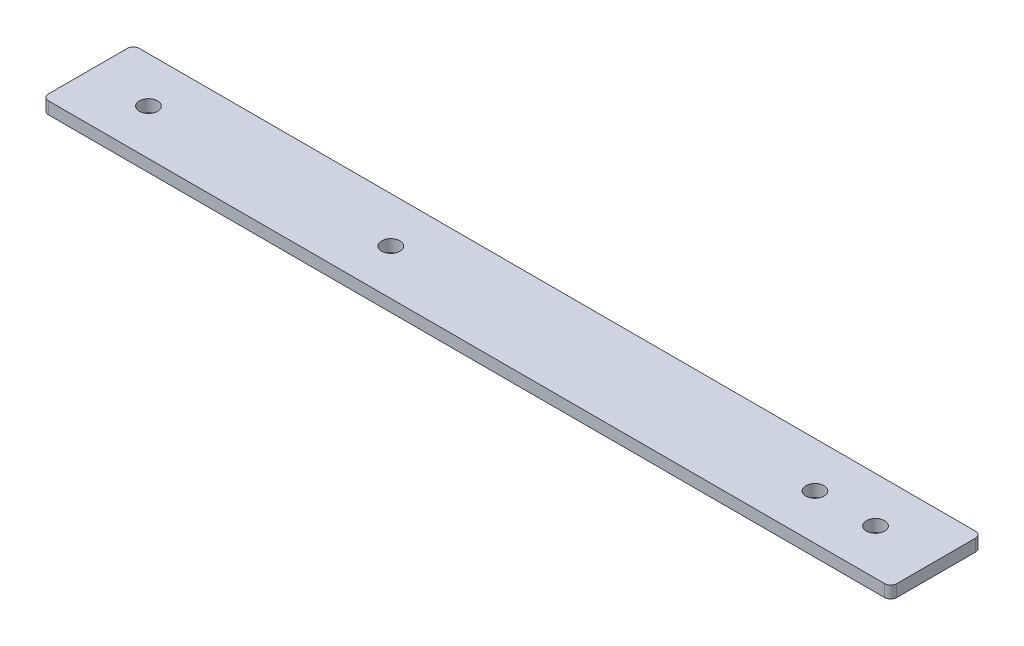
ISO-10303-21;
HEADER;
FILE_DESCRIPTION(('STEP AP214'),'2;1');
FILE_NAME('part.step','',(''),(''),'','','');
FILE_SCHEMA(('AUTOMOTIVE_DESIGN { 1 0 10303 214 1 1 1 1 }'));
ENDSEC;
DATA;
#1=APPLICATION_CONTEXT('core data for automotive mechanical design processes');
#2=APPLICATION_PROTOCOL_DEFINITION('international standard','automotive_design',2000,#1);
#3=PRODUCT_CONTEXT('',#1,'mechanical');
#4=PRODUCT('Part','Part','',(#3));
#5=PRODUCT_RELATED_PRODUCT_CATEGORY('part','',(#4));
#6=PRODUCT_DEFINITION_FORMATION('','',#4);
#7=PRODUCT_DEFINITION_CONTEXT('part definition',#1,'design');
#8=PRODUCT_DEFINITION('design','',#6,#7);
#9=PRODUCT_DEFINITION_SHAPE('','',#8);
#10=(LENGTH_UNIT() NAMED_UNIT(*) SI_UNIT(.MILLI.,.METRE.));
#11=(NAMED_UNIT(*) PLANE_ANGLE_UNIT() SI_UNIT($,.RADIAN.));
#12=(NAMED_UNIT(*) SI_UNIT($,.STERADIAN.) SOLID_ANGLE_UNIT());
#13=UNCERTAINTY_MEASURE_WITH_UNIT(LENGTH_MEASURE(1.E-05),#10,'distance_accuracy_value','');
#14=(GEOMETRIC_REPRESENTATION_CONTEXT(3) GLOBAL_UNCERTAINTY_ASSIGNED_CONTEXT((#13)) GLOBAL_UNIT_ASSIGNED_CONTEXT((#10,
#11,#12)) REPRESENTATION_CONTEXT('',''));
#15=CARTESIAN_POINT('',(0.,0.,0.));
#16=DIRECTION('',(0.,0.,1.));
#17=DIRECTION('',(1.,0.,0.));
#18=AXIS2_PLACEMENT_3D('',#15,#16,#17);
#19=CARTESIAN_POINT('',(0.,2.,0.));
#20=DIRECTION('',(0.,0.,-1.));
#21=DIRECTION('',(-1.,0.,0.));
#22=AXIS2_PLACEMENT_3D('',#19,#20,#21);
#23=PLANE('',#22);
#24=DIRECTION('',(1.,0.,0.));
#25=VECTOR('',#24,1.);
#26=CARTESIAN_POINT('',(0.,0.,0.));
#27=LINE('',#26,#25);
#28=CARTESIAN_POINT('',(1.,0.,0.));
#29=VERTEX_POINT('',#28);
#30=CARTESIAN_POINT('',(139.,0.,0.));
#31=VERTEX_POINT('',#30);
#32=EDGE_CURVE('E130',#29,#31,#27,.T.);
#33=ORIENTED_EDGE('',*,*,#32,.T.);
#34=DIRECTION('',(0.,-1.,0.));
#35=VECTOR('',#34,1.);
#36=CARTESIAN_POINT('',(139.,2.,0.));
#37=LINE('',#36,#35);
#38=CARTESIAN_POINT('',(139.,2.,0.));
#39=VERTEX_POINT('',#38);
#40=EDGE_CURVE('E107',#31,#39,#37,.F.);
#41=ORIENTED_EDGE('',*,*,#40,.T.);
#42=DIRECTION('',(1.,0.,0.));
#43=VECTOR('',#42,1.);
#44=CARTESIAN_POINT('',(0.,2.,0.));
#45=LINE('',#44,#43);
#46=CARTESIAN_POINT('',(1.,2.,0.));
#47=VERTEX_POINT('',#46);
#48=EDGE_CURVE('E145',#47,#39,#45,.T.);
#49=ORIENTED_EDGE('',*,*,#48,.F.);
#50=DIRECTION('',(0.,-1.,0.));
#51=VECTOR('',#50,1.);
#52=CARTESIAN_POINT('',(1.,0.,0.));
#53=LINE('',#52,#51);
#54=EDGE_CURVE('E112',#47,#29,#53,.T.);
#55=ORIENTED_EDGE('',*,*,#54,.T.);
#56=EDGE_LOOP('',(#33,#41,#49,#55));
#57=FACE_BOUND('',#56,.T.);
#58=ADVANCED_FACE('F35',(#57),#23,.F.);
#59=CARTESIAN_POINT('',(140.,2.,0.));
#60=DIRECTION('',(-1.,0.,0.));
#61=DIRECTION('',(0.,0.,1.));
#62=AXIS2_PLACEMENT_3D('',#59,#60,#61);
#63=PLANE('',#62);
#64=DIRECTION('',(0.,0.,-1.));
#65=VECTOR('',#64,1.);
#66=CARTESIAN_POINT('',(140.,2.,0.));
#67=LINE('',#66,#65);
#68=CARTESIAN_POINT('',(140.,2.,-1.));
#69=VERTEX_POINT('',#68);
#70=CARTESIAN_POINT('',(140.,2.,-14.));
#71=VERTEX_POINT('',#70);
#72=EDGE_CURVE('E122',#69,#71,#67,.T.);
#73=ORIENTED_EDGE('',*,*,#72,.F.);
#74=DIRECTION('',(0.,-1.,0.));
#75=VECTOR('',#74,1.);
#76=CARTESIAN_POINT('',(140.,2.,-1.));
#77=LINE('',#76,#75);
#78=CARTESIAN_POINT('',(140.,0.,-1.));
#79=VERTEX_POINT('',#78);
#80=EDGE_CURVE('E106',#69,#79,#77,.T.);
#81=ORIENTED_EDGE('',*,*,#80,.T.);
#82=DIRECTION('',(0.,0.,-1.));
#83=VECTOR('',#82,1.);
#84=CARTESIAN_POINT('',(140.,0.,0.));
#85=LINE('',#84,#83);
#86=CARTESIAN_POINT('',(140.,0.,-14.));
#87=VERTEX_POINT('',#86);
#88=EDGE_CURVE('E119',#79,#87,#85,.T.);
#89=ORIENTED_EDGE('',*,*,#88,.T.);
#90=DIRECTION('',(0.,-1.,0.));
#91=VECTOR('',#90,1.);
#92=CARTESIAN_POINT('',(140.,2.,-14.));
#93=LINE('',#92,#91);
#94=EDGE_CURVE('E124',#87,#71,#93,.F.);
#95=ORIENTED_EDGE('',*,*,#94,.T.);
#96=EDGE_LOOP('',(#73,#81,#89,#95));
#97=FACE_BOUND('',#96,.T.);
#98=ADVANCED_FACE('F118',(#97),#63,.F.);
#99=CARTESIAN_POINT('',(0.,2.,-15.));
#100=DIRECTION('',(0.,0.,-1.));
#101=DIRECTION('',(-1.,0.,0.));
#102=AXIS2_PLACEMENT_3D('',#99,#100,#101);
#103=PLANE('',#102);
#104=DIRECTION('',(1.,0.,0.));
#105=VECTOR('',#104,1.);
#106=CARTESIAN_POINT('',(0.,2.,-15.));
#107=LINE('',#106,#105);
#108=CARTESIAN_POINT('',(1.,2.,-15.));
#109=VERTEX_POINT('',#108);
#110=CARTESIAN_POINT('',(139.,2.,-15.));
#111=VERTEX_POINT('',#110);
#112=EDGE_CURVE('E185',#109,#111,#107,.T.);
#113=ORIENTED_EDGE('',*,*,#112,.T.);
#114=DIRECTION('',(0.,-1.,0.));
#115=VECTOR('',#114,1.);
#116=CARTESIAN_POINT('',(139.,0.,-15.));
#117=LINE('',#116,#115);
#118=CARTESIAN_POINT('',(139.,0.,-15.));
#119=VERTEX_POINT('',#118);
#120=EDGE_CURVE('E164',#111,#119,#117,.T.);
#121=ORIENTED_EDGE('',*,*,#120,.T.);
#122=DIRECTION('',(1.,0.,0.));
#123=VECTOR('',#122,1.);
#124=CARTESIAN_POINT('',(0.,0.,-15.));
#125=LINE('',#124,#123);
#126=CARTESIAN_POINT('',(1.,0.,-15.));
#127=VERTEX_POINT('',#126);
#128=EDGE_CURVE('E129',#127,#119,#125,.T.);
#129=ORIENTED_EDGE('',*,*,#128,.F.);
#130=DIRECTION('',(0.,-1.,0.));
#131=VECTOR('',#130,1.);
#132=CARTESIAN_POINT('',(1.,2.,-15.));
#133=LINE('',#132,#131);
#134=EDGE_CURVE('E162',#127,#109,#133,.F.);
#135=ORIENTED_EDGE('',*,*,#134,.T.);
#136=EDGE_LOOP('',(#113,#121,#129,#135));
#137=FACE_BOUND('',#136,.T.);
#138=ADVANCED_FACE('F220',(#137),#103,.T.);
#139=CARTESIAN_POINT('',(10.,2.,-7.5));
#140=DIRECTION('',(0.,-1.,0.));
#141=DIRECTION('',(0.,0.,-1.));
#142=AXIS2_PLACEMENT_3D('',#139,#140,#141);
#143=CYLINDRICAL_SURFACE('',#142,1.5);
#144=CARTESIAN_POINT('',(10.,2.,-7.5));
#145=DIRECTION('',(0.,1.,0.));
#146=DIRECTION('',(0.,0.,1.));
#147=AXIS2_PLACEMENT_3D('',#144,#145,#146);
#148=CIRCLE('',#147,1.5);
#149=CARTESIAN_POINT('',(10.,2.,-6.));
#150=VERTEX_POINT('',#149);
#151=EDGE_CURVE('E190',#150,#150,#148,.T.);
#152=ORIENTED_EDGE('',*,*,#151,.T.);
#153=EDGE_LOOP('',(#152));
#154=FACE_BOUND('',#153,.T.);
#155=CARTESIAN_POINT('',(10.,0.,-7.5));
#156=DIRECTION('',(0.,1.,0.));
#157=DIRECTION('',(0.,0.,1.));
#158=AXIS2_PLACEMENT_3D('',#155,#156,#157);
#159=CIRCLE('',#158,1.5);
#160=CARTESIAN_POINT('',(10.,0.,-6.));
#161=VERTEX_POINT('',#160);
#162=EDGE_CURVE('E139',#161,#161,#159,.T.);
#163=ORIENTED_EDGE('',*,*,#162,.F.);
#164=EDGE_LOOP('',(#163));
#165=FACE_BOUND('',#164,.T.);
#166=ADVANCED_FACE('F248',(#154,#165),#143,.F.);
#167=CARTESIAN_POINT('',(0.,2.,0.));
#168=DIRECTION('',(-1.,0.,0.));
#169=DIRECTION('',(0.,0.,1.));
#170=AXIS2_PLACEMENT_3D('',#167,#168,#169);
#171=PLANE('',#170);
#172=DIRECTION('',(0.,0.,-1.));
#173=VECTOR('',#172,1.);
#174=CARTESIAN_POINT('',(0.,0.,0.));
#175=LINE('',#174,#173);
#176=CARTESIAN_POINT('',(0.,0.,-1.));
#177=VERTEX_POINT('',#176);
#178=CARTESIAN_POINT('',(0.,0.,-14.));
#179=VERTEX_POINT('',#178);
#180=EDGE_CURVE('E132',#177,#179,#175,.T.);
#181=ORIENTED_EDGE('',*,*,#180,.F.);
#182=DIRECTION('',(0.,-1.,0.));
#183=VECTOR('',#182,1.);
#184=CARTESIAN_POINT('',(0.,2.,-1.));
#185=LINE('',#184,#183);
#186=CARTESIAN_POINT('',(0.,2.,-1.));
#187=VERTEX_POINT('',#186);
#188=EDGE_CURVE('E11',#177,#187,#185,.F.);
#189=ORIENTED_EDGE('',*,*,#188,.T.);
#190=DIRECTION('',(0.,0.,-1.));
#191=VECTOR('',#190,1.);
#192=CARTESIAN_POINT('',(0.,2.,0.));
#193=LINE('',#192,#191);
#194=CARTESIAN_POINT('',(0.,2.,-14.));
#195=VERTEX_POINT('',#194);
#196=EDGE_CURVE('E188',#187,#195,#193,.T.);
#197=ORIENTED_EDGE('',*,*,#196,.T.);
#198=DIRECTION('',(0.,-1.,0.));
#199=VECTOR('',#198,1.);
#200=CARTESIAN_POINT('',(0.,2.,-14.));
#201=LINE('',#200,#199);
#202=EDGE_CURVE('E44',#195,#179,#201,.T.);
#203=ORIENTED_EDGE('',*,*,#202,.T.);
#204=EDGE_LOOP('',(#181,#189,#197,#203));
#205=FACE_BOUND('',#204,.T.);
#206=ADVANCED_FACE('F209',(#205),#171,.T.);
#207=CARTESIAN_POINT('',(50.,2.,-7.5));
#208=DIRECTION('',(0.,-1.,0.));
#209=DIRECTION('',(0.,0.,-1.));
#210=AXIS2_PLACEMENT_3D('',#207,#208,#209);
#211=CYLINDRICAL_SURFACE('',#210,1.5);
#212=CARTESIAN_POINT('',(50.,2.,-7.5));
#213=DIRECTION('',(0.,1.,0.));
#214=DIRECTION('',(0.,0.,1.));
#215=AXIS2_PLACEMENT_3D('',#212,#213,#214);
#216=CIRCLE('',#215,1.5);
#217=CARTESIAN_POINT('',(50.,2.,-6.));
#218=VERTEX_POINT('',#217);
#219=EDGE_CURVE('E146',#218,#218,#216,.T.);
#220=ORIENTED_EDGE('',*,*,#219,.T.);
#221=EDGE_LOOP('',(#220));
#222=FACE_BOUND('',#221,.T.);
#223=CARTESIAN_POINT('',(50.,0.,-7.5));
#224=DIRECTION('',(0.,1.,0.));
#225=DIRECTION('',(0.,0.,1.));
#226=AXIS2_PLACEMENT_3D('',#223,#224,#225);
#227=CIRCLE('',#226,1.5);
#228=CARTESIAN_POINT('',(50.,0.,-6.));
#229=VERTEX_POINT('',#228);
#230=EDGE_CURVE('E142',#229,#229,#227,.T.);
#231=ORIENTED_EDGE('',*,*,#230,.F.);
#232=EDGE_LOOP('',(#231));
#233=FACE_BOUND('',#232,.T.);
#234=ADVANCED_FACE('F195',(#222,#233),#211,.F.);
#235=CARTESIAN_POINT('',(0.,2.,0.));
#236=DIRECTION('',(0.,1.,0.));
#237=DIRECTION('',(0.,0.,1.));
#238=AXIS2_PLACEMENT_3D('',#235,#236,#237);
#239=PLANE('',#238);
#240=CARTESIAN_POINT('',(130.,2.,-7.5));
#241=DIRECTION('',(0.,1.,0.));
#242=DIRECTION('',(0.,0.,1.));
#243=AXIS2_PLACEMENT_3D('',#240,#241,#242);
#244=CIRCLE('',#243,1.5);
#245=CARTESIAN_POINT('',(130.,2.,-6.));
#246=VERTEX_POINT('',#245);
#247=EDGE_CURVE('E170',#246,#246,#244,.T.);
#248=ORIENTED_EDGE('',*,*,#247,.F.);
#249=EDGE_LOOP('',(#248));
#250=FACE_BOUND('',#249,.T.);
#251=CARTESIAN_POINT('',(120.,2.,-7.5));
#252=DIRECTION('',(0.,1.,0.));
#253=DIRECTION('',(0.,0.,1.));
#254=AXIS2_PLACEMENT_3D('',#251,#252,#253);
#255=CIRCLE('',#254,1.5);
#256=CARTESIAN_POINT('',(120.,2.,-6.));
#257=VERTEX_POINT('',#256);
#258=EDGE_CURVE('E175',#257,#257,#255,.T.);
#259=ORIENTED_EDGE('',*,*,#258,.F.);
#260=EDGE_LOOP('',(#259));
#261=FACE_BOUND('',#260,.T.);
#262=ORIENTED_EDGE('',*,*,#48,.T.);
#263=CARTESIAN_POINT('',(139.,2.,-1.));
#264=DIRECTION('',(0.,1.,0.));
#265=DIRECTION('',(0.,0.,1.));
#266=AXIS2_PLACEMENT_3D('',#263,#264,#265);
#267=CIRCLE('',#266,1.);
#268=EDGE_CURVE('E160',#39,#69,#267,.T.);
#269=ORIENTED_EDGE('',*,*,#268,.T.);
#270=ORIENTED_EDGE('',*,*,#72,.T.);
#271=CARTESIAN_POINT('',(139.,2.,-14.));
#272=DIRECTION('',(0.,1.,0.));
#273=DIRECTION('',(0.,0.,1.));
#274=AXIS2_PLACEMENT_3D('',#271,#272,#273);
#275=CIRCLE('',#274,1.);
#276=EDGE_CURVE('E158',#71,#111,#275,.T.);
#277=ORIENTED_EDGE('',*,*,#276,.T.);
#278=ORIENTED_EDGE('',*,*,#112,.F.);
#279=CARTESIAN_POINT('',(1.,2.,-14.));
#280=DIRECTION('',(0.,1.,0.));
#281=DIRECTION('',(0.,0.,1.));
#282=AXIS2_PLACEMENT_3D('',#279,#280,#281);
#283=CIRCLE('',#282,1.);
#284=EDGE_CURVE('E52',#109,#195,#283,.T.);
#285=ORIENTED_EDGE('',*,*,#284,.T.);
#286=ORIENTED_EDGE('',*,*,#196,.F.);
#287=CARTESIAN_POINT('',(1.,2.,-1.));
#288=DIRECTION('',(0.,1.,0.));
#289=DIRECTION('',(0.,0.,1.));
#290=AXIS2_PLACEMENT_3D('',#287,#288,#289);
#291=CIRCLE('',#290,1.);
#292=EDGE_CURVE('E156',#187,#47,#291,.T.);
#293=ORIENTED_EDGE('',*,*,#292,.T.);
#294=EDGE_LOOP('',(#262,#269,#270,#277,#278,#285,#286,#293));
#295=FACE_BOUND('',#294,.T.);
#296=ORIENTED_EDGE('',*,*,#151,.F.);
#297=EDGE_LOOP('',(#296));
#298=FACE_BOUND('',#297,.T.);
#299=ORIENTED_EDGE('',*,*,#219,.F.);
#300=EDGE_LOOP('',(#299));
#301=FACE_BOUND('',#300,.T.);
#302=ADVANCED_FACE('F198',(#250,#261,#295,#298,#301),#239,.T.);
#303=CARTESIAN_POINT('',(0.,0.,0.));
#304=DIRECTION('',(0.,1.,0.));
#305=DIRECTION('',(0.,0.,1.));
#306=AXIS2_PLACEMENT_3D('',#303,#304,#305);
#307=PLANE('',#306);
#308=CARTESIAN_POINT('',(130.,0.,-7.5));
#309=DIRECTION('',(0.,1.,0.));
#310=DIRECTION('',(0.,0.,1.));
#311=AXIS2_PLACEMENT_3D('',#308,#309,#310);
#312=CIRCLE('',#311,1.5);
#313=CARTESIAN_POINT('',(130.,0.,-6.));
#314=VERTEX_POINT('',#313);
#315=EDGE_CURVE('E39',#314,#314,#312,.T.);
#316=ORIENTED_EDGE('',*,*,#315,.T.);
#317=EDGE_LOOP('',(#316));
#318=FACE_BOUND('',#317,.T.);
#319=CARTESIAN_POINT('',(120.,0.,-7.5));
#320=DIRECTION('',(0.,1.,0.));
#321=DIRECTION('',(0.,0.,1.));
#322=AXIS2_PLACEMENT_3D('',#319,#320,#321);
#323=CIRCLE('',#322,1.5);
#324=CARTESIAN_POINT('',(120.,0.,-6.));
#325=VERTEX_POINT('',#324);
#326=EDGE_CURVE('E168',#325,#325,#323,.T.);
#327=ORIENTED_EDGE('',*,*,#326,.T.);
#328=EDGE_LOOP('',(#327));
#329=FACE_BOUND('',#328,.T.);
#330=ORIENTED_EDGE('',*,*,#88,.F.);
#331=CARTESIAN_POINT('',(139.,0.,-1.));
#332=DIRECTION('',(0.,1.,0.));
#333=DIRECTION('',(0.,0.,1.));
#334=AXIS2_PLACEMENT_3D('',#331,#332,#333);
#335=CIRCLE('',#334,1.);
#336=EDGE_CURVE('E102',#79,#31,#335,.F.);
#337=ORIENTED_EDGE('',*,*,#336,.T.);
#338=ORIENTED_EDGE('',*,*,#32,.F.);
#339=CARTESIAN_POINT('',(1.,0.,-1.));
#340=DIRECTION('',(0.,1.,0.));
#341=DIRECTION('',(0.,0.,1.));
#342=AXIS2_PLACEMENT_3D('',#339,#340,#341);
#343=CIRCLE('',#342,1.);
#344=EDGE_CURVE('E149',#29,#177,#343,.F.);
#345=ORIENTED_EDGE('',*,*,#344,.T.);
#346=ORIENTED_EDGE('',*,*,#180,.T.);
#347=CARTESIAN_POINT('',(1.,0.,-14.));
#348=DIRECTION('',(0.,1.,0.));
#349=DIRECTION('',(0.,0.,1.));
#350=AXIS2_PLACEMENT_3D('',#347,#348,#349);
#351=CIRCLE('',#350,1.);
#352=EDGE_CURVE('E123',#179,#127,#351,.F.);
#353=ORIENTED_EDGE('',*,*,#352,.T.);
#354=ORIENTED_EDGE('',*,*,#128,.T.);
#355=CARTESIAN_POINT('',(139.,0.,-14.));
#356=DIRECTION('',(0.,1.,0.));
#357=DIRECTION('',(0.,0.,1.));
#358=AXIS2_PLACEMENT_3D('',#355,#356,#357);
#359=CIRCLE('',#358,1.);
#360=EDGE_CURVE('E113',#119,#87,#359,.F.);
#361=ORIENTED_EDGE('',*,*,#360,.T.);
#362=EDGE_LOOP('',(#330,#337,#338,#345,#346,#353,#354,#361));
#363=FACE_BOUND('',#362,.T.);
#364=ORIENTED_EDGE('',*,*,#162,.T.);
#365=EDGE_LOOP('',(#364));
#366=FACE_BOUND('',#365,.T.);
#367=ORIENTED_EDGE('',*,*,#230,.T.);
#368=EDGE_LOOP('',(#367));
#369=FACE_BOUND('',#368,.T.);
#370=ADVANCED_FACE('F126',(#318,#329,#363,#366,#369),#307,.F.);
#371=CARTESIAN_POINT('',(139.,2.,-1.));
#372=DIRECTION('',(0.,-1.,0.));
#373=DIRECTION('',(0.,0.,-1.));
#374=AXIS2_PLACEMENT_3D('',#371,#372,#373);
#375=CYLINDRICAL_SURFACE('',#374,1.);
#376=ORIENTED_EDGE('',*,*,#268,.F.);
#377=ORIENTED_EDGE('',*,*,#40,.F.);
#378=ORIENTED_EDGE('',*,*,#336,.F.);
#379=ORIENTED_EDGE('',*,*,#80,.F.);
#380=EDGE_LOOP('',(#376,#377,#378,#379));
#381=FACE_BOUND('',#380,.T.);
#382=ADVANCED_FACE('F105',(#381),#375,.T.);
#383=CARTESIAN_POINT('',(139.,2.,-14.));
#384=DIRECTION('',(0.,1.,0.));
#385=DIRECTION('',(0.,0.,1.));
#386=AXIS2_PLACEMENT_3D('',#383,#384,#385);
#387=CYLINDRICAL_SURFACE('',#386,1.);
#388=ORIENTED_EDGE('',*,*,#276,.F.);
#389=ORIENTED_EDGE('',*,*,#94,.F.);
#390=ORIENTED_EDGE('',*,*,#360,.F.);
#391=ORIENTED_EDGE('',*,*,#120,.F.);
#392=EDGE_LOOP('',(#388,#389,#390,#391));
#393=FACE_BOUND('',#392,.T.);
#394=ADVANCED_FACE('F226',(#393),#387,.T.);
#395=CARTESIAN_POINT('',(1.,2.,-1.));
#396=DIRECTION('',(0.,1.,0.));
#397=DIRECTION('',(0.,0.,1.));
#398=AXIS2_PLACEMENT_3D('',#395,#396,#397);
#399=CYLINDRICAL_SURFACE('',#398,1.);
#400=ORIENTED_EDGE('',*,*,#292,.F.);
#401=ORIENTED_EDGE('',*,*,#188,.F.);
#402=ORIENTED_EDGE('',*,*,#344,.F.);
#403=ORIENTED_EDGE('',*,*,#54,.F.);
#404=EDGE_LOOP('',(#400,#401,#402,#403));
#405=FACE_BOUND('',#404,.T.);
#406=ADVANCED_FACE('F228',(#405),#399,.T.);
#407=CARTESIAN_POINT('',(1.,2.,-14.));
#408=DIRECTION('',(0.,-1.,0.));
#409=DIRECTION('',(0.,0.,-1.));
#410=AXIS2_PLACEMENT_3D('',#407,#408,#409);
#411=CYLINDRICAL_SURFACE('',#410,1.);
#412=ORIENTED_EDGE('',*,*,#284,.F.);
#413=ORIENTED_EDGE('',*,*,#134,.F.);
#414=ORIENTED_EDGE('',*,*,#352,.F.);
#415=ORIENTED_EDGE('',*,*,#202,.F.);
#416=EDGE_LOOP('',(#412,#413,#414,#415));
#417=FACE_BOUND('',#416,.T.);
#418=ADVANCED_FACE('F37',(#417),#411,.T.);
#419=CARTESIAN_POINT('',(120.,-8.,-7.5));
#420=DIRECTION('',(0.,1.,0.));
#421=DIRECTION('',(0.,0.,1.));
#422=AXIS2_PLACEMENT_3D('',#419,#420,#421);
#423=CYLINDRICAL_SURFACE('',#422,1.5);
#424=ORIENTED_EDGE('',*,*,#258,.T.);
#425=EDGE_LOOP('',(#424));
#426=FACE_BOUND('',#425,.T.);
#427=ORIENTED_EDGE('',*,*,#326,.F.);
#428=EDGE_LOOP('',(#427));
#429=FACE_BOUND('',#428,.T.);
#430=ADVANCED_FACE('F235',(#426,#429),#423,.F.);
#431=CARTESIAN_POINT('',(130.,-8.,-7.5));
#432=DIRECTION('',(0.,1.,0.));
#433=DIRECTION('',(0.,0.,1.));
#434=AXIS2_PLACEMENT_3D('',#431,#432,#433);
#435=CYLINDRICAL_SURFACE('',#434,1.5);
#436=ORIENTED_EDGE('',*,*,#247,.T.);
#437=EDGE_LOOP('',(#436));
#438=FACE_BOUND('',#437,.T.);
#439=ORIENTED_EDGE('',*,*,#315,.F.);
#440=EDGE_LOOP('',(#439));
#441=FACE_BOUND('',#440,.T.);
#442=ADVANCED_FACE('F288',(#438,#441),#435,.F.);
#443=CLOSED_SHELL('',(#58,#98,#138,#166,#206,#234,#302,#370,#382,#394,#406,#418,#430,#442));
#444=MANIFOLD_SOLID_BREP('B2',#443);
#445=ADVANCED_BREP_SHAPE_REPRESENTATION('',(#18,#444),#14);
#446=SHAPE_DEFINITION_REPRESENTATION(#9,#445);
ENDSEC;
END-ISO-10303-21;
